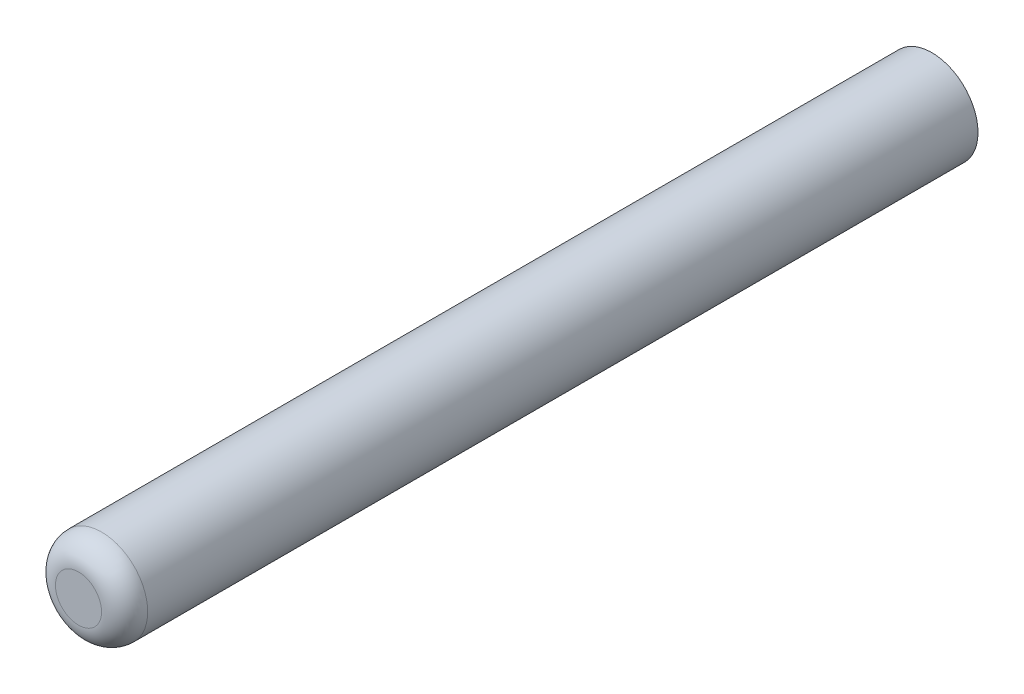
ISO-10303-21;
HEADER;
FILE_DESCRIPTION(('STEP AP214'),'2;1');
FILE_NAME('part.step','',(''),(''),'','','');
FILE_SCHEMA(('AUTOMOTIVE_DESIGN { 1 0 10303 214 1 1 1 1 }'));
ENDSEC;
DATA;
#1=APPLICATION_CONTEXT('core data for automotive mechanical design processes');
#2=APPLICATION_PROTOCOL_DEFINITION('international standard','automotive_design',2000,#1);
#3=PRODUCT_CONTEXT('',#1,'mechanical');
#4=PRODUCT('Part','Part','',(#3));
#5=PRODUCT_RELATED_PRODUCT_CATEGORY('part','',(#4));
#6=PRODUCT_DEFINITION_FORMATION('','',#4);
#7=PRODUCT_DEFINITION_CONTEXT('part definition',#1,'design');
#8=PRODUCT_DEFINITION('design','',#6,#7);
#9=PRODUCT_DEFINITION_SHAPE('','',#8);
#10=(LENGTH_UNIT() NAMED_UNIT(*) SI_UNIT(.MILLI.,.METRE.));
#11=(NAMED_UNIT(*) PLANE_ANGLE_UNIT() SI_UNIT($,.RADIAN.));
#12=(NAMED_UNIT(*) SI_UNIT($,.STERADIAN.) SOLID_ANGLE_UNIT());
#13=UNCERTAINTY_MEASURE_WITH_UNIT(LENGTH_MEASURE(1.E-05),#10,'distance_accuracy_value','');
#14=(GEOMETRIC_REPRESENTATION_CONTEXT(3) GLOBAL_UNCERTAINTY_ASSIGNED_CONTEXT((#13)) GLOBAL_UNIT_ASSIGNED_CONTEXT((#10,
#11,#12)) REPRESENTATION_CONTEXT('',''));
#15=CARTESIAN_POINT('',(0.,0.,0.));
#16=DIRECTION('',(0.,0.,1.));
#17=DIRECTION('',(1.,0.,0.));
#18=AXIS2_PLACEMENT_3D('',#15,#16,#17);
#19=CARTESIAN_POINT('',(-33.053163920906,3.49008563140001,37.));
#20=DIRECTION('',(0.,0.,-1.));
#21=DIRECTION('',(-1.,0.,0.));
#22=AXIS2_PLACEMENT_3D('',#19,#20,#21);
#23=CYLINDRICAL_SURFACE('',#22,2.);
#24=CARTESIAN_POINT('',(-33.053163920906,3.49008563140001,36.));
#25=DIRECTION('',(0.,0.,1.));
#26=DIRECTION('',(1.,0.,0.));
#27=AXIS2_PLACEMENT_3D('',#24,#25,#26);
#28=CIRCLE('',#27,2.);
#29=CARTESIAN_POINT('',(-31.053163920906,3.49008563140001,36.));
#30=VERTEX_POINT('',#29);
#31=EDGE_CURVE('E10',#30,#30,#28,.F.);
#32=ORIENTED_EDGE('',*,*,#31,.T.);
#33=EDGE_LOOP('',(#32));
#34=FACE_BOUND('',#33,.T.);
#35=CARTESIAN_POINT('',(-33.053163920906,3.49008563140001,0.));
#36=DIRECTION('',(0.,0.,1.));
#37=DIRECTION('',(1.,0.,0.));
#38=AXIS2_PLACEMENT_3D('',#35,#36,#37);
#39=CIRCLE('',#38,2.);
#40=CARTESIAN_POINT('',(-31.053163920906,3.49008563140001,0.));
#41=VERTEX_POINT('',#40);
#42=EDGE_CURVE('E42',#41,#41,#39,.T.);
#43=ORIENTED_EDGE('',*,*,#42,.T.);
#44=EDGE_LOOP('',(#43));
#45=FACE_BOUND('',#44,.T.);
#46=ADVANCED_FACE('F31',(#34,#45),#23,.T.);
#47=CARTESIAN_POINT('',(-33.053163920906,3.49008563140001,37.));
#48=DIRECTION('',(0.,0.,1.));
#49=DIRECTION('',(1.,0.,0.));
#50=AXIS2_PLACEMENT_3D('',#47,#48,#49);
#51=PLANE('',#50);
#52=CARTESIAN_POINT('',(-33.053163920906,3.49008563140001,37.));
#53=DIRECTION('',(0.,0.,1.));
#54=DIRECTION('',(1.,0.,0.));
#55=AXIS2_PLACEMENT_3D('',#52,#53,#54);
#56=CIRCLE('',#55,1.);
#57=CARTESIAN_POINT('',(-32.053163920906,3.49008563140001,37.));
#58=VERTEX_POINT('',#57);
#59=EDGE_CURVE('E38',#58,#58,#56,.T.);
#60=ORIENTED_EDGE('',*,*,#59,.T.);
#61=EDGE_LOOP('',(#60));
#62=FACE_BOUND('',#61,.T.);
#63=ADVANCED_FACE('F52',(#62),#51,.T.);
#64=CARTESIAN_POINT('',(-33.053163920906,3.49008563140001,0.));
#65=DIRECTION('',(0.,0.,1.));
#66=DIRECTION('',(1.,0.,0.));
#67=AXIS2_PLACEMENT_3D('',#64,#65,#66);
#68=PLANE('',#67);
#69=ORIENTED_EDGE('',*,*,#42,.F.);
#70=EDGE_LOOP('',(#69));
#71=FACE_BOUND('',#70,.T.);
#72=ADVANCED_FACE('F50',(#71),#68,.F.);
#73=CARTESIAN_POINT('',(-33.053163920906,3.49008563140001,36.));
#74=DIRECTION('',(0.,0.,1.));
#75=DIRECTION('',(1.,0.,0.));
#76=AXIS2_PLACEMENT_3D('',#73,#74,#75);
#77=TOROIDAL_SURFACE('',#76,1.,1.);
#78=ORIENTED_EDGE('',*,*,#31,.F.);
#79=EDGE_LOOP('',(#78));
#80=FACE_BOUND('',#79,.T.);
#81=ORIENTED_EDGE('',*,*,#59,.F.);
#82=EDGE_LOOP('',(#81));
#83=FACE_BOUND('',#82,.T.);
#84=ADVANCED_FACE('F33',(#80,#83),#77,.T.);
#85=CLOSED_SHELL('',(#46,#63,#72,#84));
#86=MANIFOLD_SOLID_BREP('B2',#85);
#87=ADVANCED_BREP_SHAPE_REPRESENTATION('',(#18,#86),#14);
#88=SHAPE_DEFINITION_REPRESENTATION(#9,#87);
ENDSEC;
END-ISO-10303-21;
